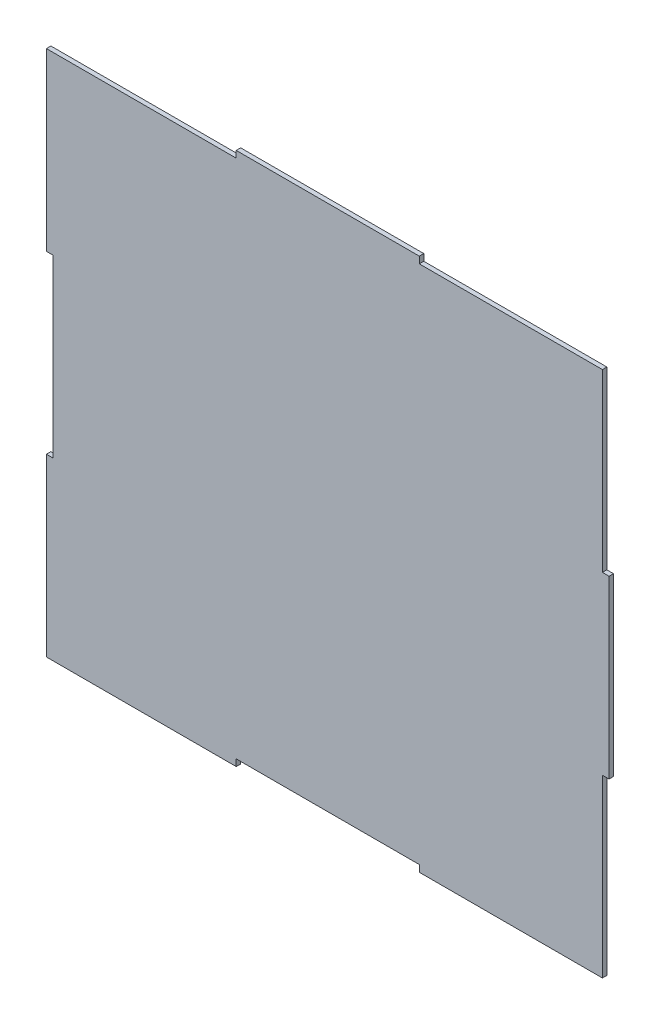
ISO-10303-21;
HEADER;
FILE_DESCRIPTION(('STEP AP214'),'2;1');
FILE_NAME('part.step','',(''),(''),'','','');
FILE_SCHEMA(('AUTOMOTIVE_DESIGN { 1 0 10303 214 1 1 1 1 }'));
ENDSEC;
DATA;
#1=APPLICATION_CONTEXT('core data for automotive mechanical design processes');
#2=APPLICATION_PROTOCOL_DEFINITION('international standard','automotive_design',2000,#1);
#3=PRODUCT_CONTEXT('',#1,'mechanical');
#4=PRODUCT('Part','Part','',(#3));
#5=PRODUCT_RELATED_PRODUCT_CATEGORY('part','',(#4));
#6=PRODUCT_DEFINITION_FORMATION('','',#4);
#7=PRODUCT_DEFINITION_CONTEXT('part definition',#1,'design');
#8=PRODUCT_DEFINITION('design','',#6,#7);
#9=PRODUCT_DEFINITION_SHAPE('','',#8);
#10=(LENGTH_UNIT() NAMED_UNIT(*) SI_UNIT(.MILLI.,.METRE.));
#11=(NAMED_UNIT(*) PLANE_ANGLE_UNIT() SI_UNIT($,.RADIAN.));
#12=(NAMED_UNIT(*) SI_UNIT($,.STERADIAN.) SOLID_ANGLE_UNIT());
#13=UNCERTAINTY_MEASURE_WITH_UNIT(LENGTH_MEASURE(1.E-05),#10,'distance_accuracy_value','');
#14=(GEOMETRIC_REPRESENTATION_CONTEXT(3) GLOBAL_UNCERTAINTY_ASSIGNED_CONTEXT((#13)) GLOBAL_UNIT_ASSIGNED_CONTEXT((#10,
#11,#12)) REPRESENTATION_CONTEXT('',''));
#15=CARTESIAN_POINT('',(0.,0.,0.));
#16=DIRECTION('',(0.,0.,1.));
#17=DIRECTION('',(1.,0.,0.));
#18=AXIS2_PLACEMENT_3D('',#15,#16,#17);
#19=CARTESIAN_POINT('',(-41.,-118.,2.));
#20=DIRECTION('',(-1.,0.,0.));
#21=DIRECTION('',(0.,0.,1.));
#22=AXIS2_PLACEMENT_3D('',#19,#20,#21);
#23=PLANE('',#22);
#24=DIRECTION('',(0.,1.,0.));
#25=VECTOR('',#24,1.);
#26=CARTESIAN_POINT('',(-41.,-118.,0.));
#27=LINE('',#26,#25);
#28=CARTESIAN_POINT('',(-41.,-118.,0.));
#29=VERTEX_POINT('',#28);
#30=CARTESIAN_POINT('',(-41.,-115.,0.));
#31=VERTEX_POINT('',#30);
#32=EDGE_CURVE('E202',#29,#31,#27,.T.);
#33=ORIENTED_EDGE('',*,*,#32,.T.);
#34=DIRECTION('',(0.,0.,-1.));
#35=VECTOR('',#34,1.);
#36=CARTESIAN_POINT('',(-41.,-115.,2.));
#37=LINE('',#36,#35);
#38=CARTESIAN_POINT('',(-41.,-115.,2.));
#39=VERTEX_POINT('',#38);
#40=EDGE_CURVE('E11',#39,#31,#37,.T.);
#41=ORIENTED_EDGE('',*,*,#40,.F.);
#42=DIRECTION('',(0.,1.,0.));
#43=VECTOR('',#42,1.);
#44=CARTESIAN_POINT('',(-41.,-118.,2.));
#45=LINE('',#44,#43);
#46=CARTESIAN_POINT('',(-41.,-118.,2.));
#47=VERTEX_POINT('',#46);
#48=EDGE_CURVE('E242',#47,#39,#45,.T.);
#49=ORIENTED_EDGE('',*,*,#48,.F.);
#50=DIRECTION('',(0.,0.,-1.));
#51=VECTOR('',#50,1.);
#52=CARTESIAN_POINT('',(-41.,-118.,2.));
#53=LINE('',#52,#51);
#54=EDGE_CURVE('E198',#47,#29,#53,.T.);
#55=ORIENTED_EDGE('',*,*,#54,.T.);
#56=EDGE_LOOP('',(#33,#41,#49,#55));
#57=FACE_BOUND('',#56,.T.);
#58=ADVANCED_FACE('F33',(#57),#23,.F.);
#59=CARTESIAN_POINT('',(-41.,-115.,2.));
#60=DIRECTION('',(0.,1.,0.));
#61=DIRECTION('',(0.,0.,1.));
#62=AXIS2_PLACEMENT_3D('',#59,#60,#61);
#63=PLANE('',#62);
#64=DIRECTION('',(1.,0.,0.));
#65=VECTOR('',#64,1.);
#66=CARTESIAN_POINT('',(-41.,-115.,0.));
#67=LINE('',#66,#65);
#68=CARTESIAN_POINT('',(41.,-115.,0.));
#69=VERTEX_POINT('',#68);
#70=EDGE_CURVE('E205',#31,#69,#67,.T.);
#71=ORIENTED_EDGE('',*,*,#70,.T.);
#72=DIRECTION('',(0.,0.,-1.));
#73=VECTOR('',#72,1.);
#74=CARTESIAN_POINT('',(41.,-115.,2.));
#75=LINE('',#74,#73);
#76=CARTESIAN_POINT('',(41.,-115.,2.));
#77=VERTEX_POINT('',#76);
#78=EDGE_CURVE('E41',#77,#69,#75,.T.);
#79=ORIENTED_EDGE('',*,*,#78,.F.);
#80=DIRECTION('',(1.,0.,0.));
#81=VECTOR('',#80,1.);
#82=CARTESIAN_POINT('',(-41.,-115.,2.));
#83=LINE('',#82,#81);
#84=EDGE_CURVE('E126',#39,#77,#83,.T.);
#85=ORIENTED_EDGE('',*,*,#84,.F.);
#86=ORIENTED_EDGE('',*,*,#40,.T.);
#87=EDGE_LOOP('',(#71,#79,#85,#86));
#88=FACE_BOUND('',#87,.T.);
#89=ADVANCED_FACE('F350',(#88),#63,.F.);
#90=CARTESIAN_POINT('',(41.,-118.,2.));
#91=DIRECTION('',(1.,0.,0.));
#92=DIRECTION('',(0.,0.,-1.));
#93=AXIS2_PLACEMENT_3D('',#90,#91,#92);
#94=PLANE('',#93);
#95=DIRECTION('',(0.,-1.,0.));
#96=VECTOR('',#95,1.);
#97=CARTESIAN_POINT('',(41.,-118.,0.));
#98=LINE('',#97,#96);
#99=CARTESIAN_POINT('',(41.,-118.,0.));
#100=VERTEX_POINT('',#99);
#101=EDGE_CURVE('E207',#69,#100,#98,.T.);
#102=ORIENTED_EDGE('',*,*,#101,.T.);
#103=DIRECTION('',(0.,0.,-1.));
#104=VECTOR('',#103,1.);
#105=CARTESIAN_POINT('',(41.,-118.,2.));
#106=LINE('',#105,#104);
#107=CARTESIAN_POINT('',(41.,-118.,2.));
#108=VERTEX_POINT('',#107);
#109=EDGE_CURVE('E285',#108,#100,#106,.T.);
#110=ORIENTED_EDGE('',*,*,#109,.F.);
#111=DIRECTION('',(0.,-1.,0.));
#112=VECTOR('',#111,1.);
#113=CARTESIAN_POINT('',(41.,-118.,2.));
#114=LINE('',#113,#112);
#115=EDGE_CURVE('E293',#77,#108,#114,.T.);
#116=ORIENTED_EDGE('',*,*,#115,.F.);
#117=ORIENTED_EDGE('',*,*,#78,.T.);
#118=EDGE_LOOP('',(#102,#110,#116,#117));
#119=FACE_BOUND('',#118,.T.);
#120=ADVANCED_FACE('F291',(#119),#94,.F.);
#121=CARTESIAN_POINT('',(41.,-118.,2.));
#122=DIRECTION('',(0.,1.,0.));
#123=DIRECTION('',(0.,0.,1.));
#124=AXIS2_PLACEMENT_3D('',#121,#122,#123);
#125=PLANE('',#124);
#126=DIRECTION('',(1.,0.,0.));
#127=VECTOR('',#126,1.);
#128=CARTESIAN_POINT('',(41.,-118.,0.));
#129=LINE('',#128,#127);
#130=CARTESIAN_POINT('',(123.,-118.,0.));
#131=VERTEX_POINT('',#130);
#132=EDGE_CURVE('E209',#100,#131,#129,.T.);
#133=ORIENTED_EDGE('',*,*,#132,.T.);
#134=DIRECTION('',(0.,0.,-1.));
#135=VECTOR('',#134,1.);
#136=CARTESIAN_POINT('',(123.,-118.,2.));
#137=LINE('',#136,#135);
#138=CARTESIAN_POINT('',(123.,-118.,2.));
#139=VERTEX_POINT('',#138);
#140=EDGE_CURVE('E282',#139,#131,#137,.T.);
#141=ORIENTED_EDGE('',*,*,#140,.F.);
#142=DIRECTION('',(1.,0.,0.));
#143=VECTOR('',#142,1.);
#144=CARTESIAN_POINT('',(41.,-118.,2.));
#145=LINE('',#144,#143);
#146=EDGE_CURVE('E309',#108,#139,#145,.T.);
#147=ORIENTED_EDGE('',*,*,#146,.F.);
#148=ORIENTED_EDGE('',*,*,#109,.T.);
#149=EDGE_LOOP('',(#133,#141,#147,#148));
#150=FACE_BOUND('',#149,.T.);
#151=ADVANCED_FACE('F300',(#150),#125,.F.);
#152=CARTESIAN_POINT('',(123.,-118.,2.));
#153=DIRECTION('',(-1.,0.,0.));
#154=DIRECTION('',(0.,0.,1.));
#155=AXIS2_PLACEMENT_3D('',#152,#153,#154);
#156=PLANE('',#155);
#157=DIRECTION('',(0.,1.,0.));
#158=VECTOR('',#157,1.);
#159=CARTESIAN_POINT('',(123.,-118.,0.));
#160=LINE('',#159,#158);
#161=CARTESIAN_POINT('',(123.,-39.3333333333333,0.));
#162=VERTEX_POINT('',#161);
#163=EDGE_CURVE('E211',#131,#162,#160,.T.);
#164=ORIENTED_EDGE('',*,*,#163,.T.);
#165=DIRECTION('',(0.,0.,-1.));
#166=VECTOR('',#165,1.);
#167=CARTESIAN_POINT('',(123.,-39.3333333333333,2.));
#168=LINE('',#167,#166);
#169=CARTESIAN_POINT('',(123.,-39.3333333333333,2.));
#170=VERTEX_POINT('',#169);
#171=EDGE_CURVE('E279',#170,#162,#168,.T.);
#172=ORIENTED_EDGE('',*,*,#171,.F.);
#173=DIRECTION('',(0.,1.,0.));
#174=VECTOR('',#173,1.);
#175=CARTESIAN_POINT('',(123.,-118.,2.));
#176=LINE('',#175,#174);
#177=EDGE_CURVE('E306',#139,#170,#176,.T.);
#178=ORIENTED_EDGE('',*,*,#177,.F.);
#179=ORIENTED_EDGE('',*,*,#140,.T.);
#180=EDGE_LOOP('',(#164,#172,#178,#179));
#181=FACE_BOUND('',#180,.T.);
#182=ADVANCED_FACE('F304',(#181),#156,.F.);
#183=CARTESIAN_POINT('',(123.,-39.3333333333333,2.));
#184=DIRECTION('',(0.,1.,0.));
#185=DIRECTION('',(0.,0.,1.));
#186=AXIS2_PLACEMENT_3D('',#183,#184,#185);
#187=PLANE('',#186);
#188=DIRECTION('',(1.,0.,0.));
#189=VECTOR('',#188,1.);
#190=CARTESIAN_POINT('',(123.,-39.3333333333333,0.));
#191=LINE('',#190,#189);
#192=CARTESIAN_POINT('',(126.,-39.3333333333333,0.));
#193=VERTEX_POINT('',#192);
#194=EDGE_CURVE('E213',#162,#193,#191,.T.);
#195=ORIENTED_EDGE('',*,*,#194,.T.);
#196=DIRECTION('',(0.,0.,-1.));
#197=VECTOR('',#196,1.);
#198=CARTESIAN_POINT('',(126.,-39.3333333333333,2.));
#199=LINE('',#198,#197);
#200=CARTESIAN_POINT('',(126.,-39.3333333333333,2.));
#201=VERTEX_POINT('',#200);
#202=EDGE_CURVE('E276',#201,#193,#199,.T.);
#203=ORIENTED_EDGE('',*,*,#202,.F.);
#204=DIRECTION('',(1.,0.,0.));
#205=VECTOR('',#204,1.);
#206=CARTESIAN_POINT('',(123.,-39.3333333333333,2.));
#207=LINE('',#206,#205);
#208=EDGE_CURVE('E308',#170,#201,#207,.T.);
#209=ORIENTED_EDGE('',*,*,#208,.F.);
#210=ORIENTED_EDGE('',*,*,#171,.T.);
#211=EDGE_LOOP('',(#195,#203,#209,#210));
#212=FACE_BOUND('',#211,.T.);
#213=ADVANCED_FACE('F362',(#212),#187,.F.);
#214=CARTESIAN_POINT('',(126.,-39.3333333333333,2.));
#215=DIRECTION('',(-1.,0.,0.));
#216=DIRECTION('',(0.,0.,1.));
#217=AXIS2_PLACEMENT_3D('',#214,#215,#216);
#218=PLANE('',#217);
#219=DIRECTION('',(0.,1.,0.));
#220=VECTOR('',#219,1.);
#221=CARTESIAN_POINT('',(126.,-39.3333333333333,0.));
#222=LINE('',#221,#220);
#223=CARTESIAN_POINT('',(126.,39.3333333333334,0.));
#224=VERTEX_POINT('',#223);
#225=EDGE_CURVE('E215',#193,#224,#222,.T.);
#226=ORIENTED_EDGE('',*,*,#225,.T.);
#227=DIRECTION('',(0.,0.,-1.));
#228=VECTOR('',#227,1.);
#229=CARTESIAN_POINT('',(126.,39.3333333333334,2.));
#230=LINE('',#229,#228);
#231=CARTESIAN_POINT('',(126.,39.3333333333334,2.));
#232=VERTEX_POINT('',#231);
#233=EDGE_CURVE('E273',#232,#224,#230,.T.);
#234=ORIENTED_EDGE('',*,*,#233,.F.);
#235=DIRECTION('',(0.,1.,0.));
#236=VECTOR('',#235,1.);
#237=CARTESIAN_POINT('',(126.,-39.3333333333333,2.));
#238=LINE('',#237,#236);
#239=EDGE_CURVE('E311',#201,#232,#238,.T.);
#240=ORIENTED_EDGE('',*,*,#239,.F.);
#241=ORIENTED_EDGE('',*,*,#202,.T.);
#242=EDGE_LOOP('',(#226,#234,#240,#241));
#243=FACE_BOUND('',#242,.T.);
#244=ADVANCED_FACE('F365',(#243),#218,.F.);
#245=CARTESIAN_POINT('',(123.,39.3333333333334,2.));
#246=DIRECTION('',(0.,-1.,0.));
#247=DIRECTION('',(0.,0.,-1.));
#248=AXIS2_PLACEMENT_3D('',#245,#246,#247);
#249=PLANE('',#248);
#250=DIRECTION('',(-1.,0.,0.));
#251=VECTOR('',#250,1.);
#252=CARTESIAN_POINT('',(123.,39.3333333333334,0.));
#253=LINE('',#252,#251);
#254=CARTESIAN_POINT('',(123.,39.3333333333334,0.));
#255=VERTEX_POINT('',#254);
#256=EDGE_CURVE('E217',#224,#255,#253,.T.);
#257=ORIENTED_EDGE('',*,*,#256,.T.);
#258=DIRECTION('',(0.,0.,-1.));
#259=VECTOR('',#258,1.);
#260=CARTESIAN_POINT('',(123.,39.3333333333334,2.));
#261=LINE('',#260,#259);
#262=CARTESIAN_POINT('',(123.,39.3333333333334,2.));
#263=VERTEX_POINT('',#262);
#264=EDGE_CURVE('E270',#263,#255,#261,.T.);
#265=ORIENTED_EDGE('',*,*,#264,.F.);
#266=DIRECTION('',(-1.,0.,0.));
#267=VECTOR('',#266,1.);
#268=CARTESIAN_POINT('',(123.,39.3333333333334,2.));
#269=LINE('',#268,#267);
#270=EDGE_CURVE('E317',#232,#263,#269,.T.);
#271=ORIENTED_EDGE('',*,*,#270,.F.);
#272=ORIENTED_EDGE('',*,*,#233,.T.);
#273=EDGE_LOOP('',(#257,#265,#271,#272));
#274=FACE_BOUND('',#273,.T.);
#275=ADVANCED_FACE('F369',(#274),#249,.F.);
#276=CARTESIAN_POINT('',(123.,39.3333333333334,2.));
#277=DIRECTION('',(-1.,0.,0.));
#278=DIRECTION('',(0.,0.,1.));
#279=AXIS2_PLACEMENT_3D('',#276,#277,#278);
#280=PLANE('',#279);
#281=DIRECTION('',(0.,1.,0.));
#282=VECTOR('',#281,1.);
#283=CARTESIAN_POINT('',(123.,39.3333333333334,0.));
#284=LINE('',#283,#282);
#285=CARTESIAN_POINT('',(123.,118.,0.));
#286=VERTEX_POINT('',#285);
#287=EDGE_CURVE('E219',#255,#286,#284,.T.);
#288=ORIENTED_EDGE('',*,*,#287,.T.);
#289=DIRECTION('',(0.,0.,-1.));
#290=VECTOR('',#289,1.);
#291=CARTESIAN_POINT('',(123.,118.,2.));
#292=LINE('',#291,#290);
#293=CARTESIAN_POINT('',(123.,118.,2.));
#294=VERTEX_POINT('',#293);
#295=EDGE_CURVE('E267',#294,#286,#292,.T.);
#296=ORIENTED_EDGE('',*,*,#295,.F.);
#297=DIRECTION('',(0.,1.,0.));
#298=VECTOR('',#297,1.);
#299=CARTESIAN_POINT('',(123.,39.3333333333334,2.));
#300=LINE('',#299,#298);
#301=EDGE_CURVE('E319',#263,#294,#300,.T.);
#302=ORIENTED_EDGE('',*,*,#301,.F.);
#303=ORIENTED_EDGE('',*,*,#264,.T.);
#304=EDGE_LOOP('',(#288,#296,#302,#303));
#305=FACE_BOUND('',#304,.T.);
#306=ADVANCED_FACE('F373',(#305),#280,.F.);
#307=CARTESIAN_POINT('',(41.,118.,2.));
#308=DIRECTION('',(0.,-1.,0.));
#309=DIRECTION('',(0.,0.,-1.));
#310=AXIS2_PLACEMENT_3D('',#307,#308,#309);
#311=PLANE('',#310);
#312=DIRECTION('',(-1.,0.,0.));
#313=VECTOR('',#312,1.);
#314=CARTESIAN_POINT('',(41.,118.,0.));
#315=LINE('',#314,#313);
#316=CARTESIAN_POINT('',(41.,118.,0.));
#317=VERTEX_POINT('',#316);
#318=EDGE_CURVE('E221',#286,#317,#315,.T.);
#319=ORIENTED_EDGE('',*,*,#318,.T.);
#320=DIRECTION('',(0.,0.,-1.));
#321=VECTOR('',#320,1.);
#322=CARTESIAN_POINT('',(41.,118.,2.));
#323=LINE('',#322,#321);
#324=CARTESIAN_POINT('',(41.,118.,2.));
#325=VERTEX_POINT('',#324);
#326=EDGE_CURVE('E264',#325,#317,#323,.T.);
#327=ORIENTED_EDGE('',*,*,#326,.F.);
#328=DIRECTION('',(-1.,0.,0.));
#329=VECTOR('',#328,1.);
#330=CARTESIAN_POINT('',(41.,118.,2.));
#331=LINE('',#330,#329);
#332=EDGE_CURVE('E321',#294,#325,#331,.T.);
#333=ORIENTED_EDGE('',*,*,#332,.F.);
#334=ORIENTED_EDGE('',*,*,#295,.T.);
#335=EDGE_LOOP('',(#319,#327,#333,#334));
#336=FACE_BOUND('',#335,.T.);
#337=ADVANCED_FACE('F377',(#336),#311,.F.);
#338=CARTESIAN_POINT('',(41.,118.,2.));
#339=DIRECTION('',(-1.,0.,0.));
#340=DIRECTION('',(0.,0.,1.));
#341=AXIS2_PLACEMENT_3D('',#338,#339,#340);
#342=PLANE('',#341);
#343=DIRECTION('',(0.,1.,0.));
#344=VECTOR('',#343,1.);
#345=CARTESIAN_POINT('',(41.,118.,0.));
#346=LINE('',#345,#344);
#347=CARTESIAN_POINT('',(41.,121.,0.));
#348=VERTEX_POINT('',#347);
#349=EDGE_CURVE('E223',#317,#348,#346,.T.);
#350=ORIENTED_EDGE('',*,*,#349,.T.);
#351=DIRECTION('',(0.,0.,-1.));
#352=VECTOR('',#351,1.);
#353=CARTESIAN_POINT('',(41.,121.,2.));
#354=LINE('',#353,#352);
#355=CARTESIAN_POINT('',(41.,121.,2.));
#356=VERTEX_POINT('',#355);
#357=EDGE_CURVE('E261',#356,#348,#354,.T.);
#358=ORIENTED_EDGE('',*,*,#357,.F.);
#359=DIRECTION('',(0.,1.,0.));
#360=VECTOR('',#359,1.);
#361=CARTESIAN_POINT('',(41.,118.,2.));
#362=LINE('',#361,#360);
#363=EDGE_CURVE('E323',#325,#356,#362,.T.);
#364=ORIENTED_EDGE('',*,*,#363,.F.);
#365=ORIENTED_EDGE('',*,*,#326,.T.);
#366=EDGE_LOOP('',(#350,#358,#364,#365));
#367=FACE_BOUND('',#366,.T.);
#368=ADVANCED_FACE('F381',(#367),#342,.F.);
#369=CARTESIAN_POINT('',(-41.,121.,2.));
#370=DIRECTION('',(0.,-1.,0.));
#371=DIRECTION('',(1.,0.,0.));
#372=AXIS2_PLACEMENT_3D('',#369,#370,#371);
#373=PLANE('',#372);
#374=DIRECTION('',(-1.,0.,0.));
#375=VECTOR('',#374,1.);
#376=CARTESIAN_POINT('',(-41.,121.,0.));
#377=LINE('',#376,#375);
#378=CARTESIAN_POINT('',(-41.,121.,0.));
#379=VERTEX_POINT('',#378);
#380=EDGE_CURVE('E225',#348,#379,#377,.T.);
#381=ORIENTED_EDGE('',*,*,#380,.T.);
#382=DIRECTION('',(0.,0.,-1.));
#383=VECTOR('',#382,1.);
#384=CARTESIAN_POINT('',(-41.,121.,2.));
#385=LINE('',#384,#383);
#386=CARTESIAN_POINT('',(-41.,121.,2.));
#387=VERTEX_POINT('',#386);
#388=EDGE_CURVE('E258',#387,#379,#385,.T.);
#389=ORIENTED_EDGE('',*,*,#388,.F.);
#390=DIRECTION('',(-1.,0.,0.));
#391=VECTOR('',#390,1.);
#392=CARTESIAN_POINT('',(-41.,121.,2.));
#393=LINE('',#392,#391);
#394=EDGE_CURVE('E325',#356,#387,#393,.T.);
#395=ORIENTED_EDGE('',*,*,#394,.F.);
#396=ORIENTED_EDGE('',*,*,#357,.T.);
#397=EDGE_LOOP('',(#381,#389,#395,#396));
#398=FACE_BOUND('',#397,.T.);
#399=ADVANCED_FACE('F385',(#398),#373,.F.);
#400=CARTESIAN_POINT('',(-41.,118.,2.));
#401=DIRECTION('',(1.,0.,0.));
#402=DIRECTION('',(0.,0.,-1.));
#403=AXIS2_PLACEMENT_3D('',#400,#401,#402);
#404=PLANE('',#403);
#405=DIRECTION('',(0.,-1.,0.));
#406=VECTOR('',#405,1.);
#407=CARTESIAN_POINT('',(-41.,118.,0.));
#408=LINE('',#407,#406);
#409=CARTESIAN_POINT('',(-41.,118.,0.));
#410=VERTEX_POINT('',#409);
#411=EDGE_CURVE('E227',#379,#410,#408,.T.);
#412=ORIENTED_EDGE('',*,*,#411,.T.);
#413=DIRECTION('',(0.,0.,-1.));
#414=VECTOR('',#413,1.);
#415=CARTESIAN_POINT('',(-41.,118.,2.));
#416=LINE('',#415,#414);
#417=CARTESIAN_POINT('',(-41.,118.,2.));
#418=VERTEX_POINT('',#417);
#419=EDGE_CURVE('E255',#418,#410,#416,.T.);
#420=ORIENTED_EDGE('',*,*,#419,.F.);
#421=DIRECTION('',(0.,-1.,0.));
#422=VECTOR('',#421,1.);
#423=CARTESIAN_POINT('',(-41.,118.,2.));
#424=LINE('',#423,#422);
#425=EDGE_CURVE('E327',#387,#418,#424,.T.);
#426=ORIENTED_EDGE('',*,*,#425,.F.);
#427=ORIENTED_EDGE('',*,*,#388,.T.);
#428=EDGE_LOOP('',(#412,#420,#426,#427));
#429=FACE_BOUND('',#428,.T.);
#430=ADVANCED_FACE('F389',(#429),#404,.F.);
#431=CARTESIAN_POINT('',(-123.,118.,2.));
#432=DIRECTION('',(0.,-1.,0.));
#433=DIRECTION('',(1.,0.,0.));
#434=AXIS2_PLACEMENT_3D('',#431,#432,#433);
#435=PLANE('',#434);
#436=DIRECTION('',(-1.,0.,0.));
#437=VECTOR('',#436,1.);
#438=CARTESIAN_POINT('',(-123.,118.,0.));
#439=LINE('',#438,#437);
#440=CARTESIAN_POINT('',(-126.,118.,0.));
#441=VERTEX_POINT('',#440);
#442=EDGE_CURVE('E230',#410,#441,#439,.T.);
#443=ORIENTED_EDGE('',*,*,#442,.T.);
#444=DIRECTION('',(0.,0.,-1.));
#445=VECTOR('',#444,1.);
#446=CARTESIAN_POINT('',(-126.,118.,2.));
#447=LINE('',#446,#445);
#448=CARTESIAN_POINT('',(-126.,118.,2.));
#449=VERTEX_POINT('',#448);
#450=EDGE_CURVE('E252',#449,#441,#447,.T.);
#451=ORIENTED_EDGE('',*,*,#450,.F.);
#452=DIRECTION('',(-1.,0.,0.));
#453=VECTOR('',#452,1.);
#454=CARTESIAN_POINT('',(-123.,118.,2.));
#455=LINE('',#454,#453);
#456=EDGE_CURVE('E329',#418,#449,#455,.T.);
#457=ORIENTED_EDGE('',*,*,#456,.F.);
#458=ORIENTED_EDGE('',*,*,#419,.T.);
#459=EDGE_LOOP('',(#443,#451,#457,#458));
#460=FACE_BOUND('',#459,.T.);
#461=ADVANCED_FACE('F393',(#460),#435,.F.);
#462=CARTESIAN_POINT('',(-126.,118.,2.));
#463=DIRECTION('',(1.,0.,0.));
#464=DIRECTION('',(0.,0.,-1.));
#465=AXIS2_PLACEMENT_3D('',#462,#463,#464);
#466=PLANE('',#465);
#467=DIRECTION('',(0.,-1.,0.));
#468=VECTOR('',#467,1.);
#469=CARTESIAN_POINT('',(-126.,118.,0.));
#470=LINE('',#469,#468);
#471=CARTESIAN_POINT('',(-126.,39.3333333333334,0.));
#472=VERTEX_POINT('',#471);
#473=EDGE_CURVE('E232',#441,#472,#470,.T.);
#474=ORIENTED_EDGE('',*,*,#473,.T.);
#475=DIRECTION('',(0.,0.,-1.));
#476=VECTOR('',#475,1.);
#477=CARTESIAN_POINT('',(-126.,39.3333333333334,2.));
#478=LINE('',#477,#476);
#479=CARTESIAN_POINT('',(-126.,39.3333333333334,2.));
#480=VERTEX_POINT('',#479);
#481=EDGE_CURVE('E249',#480,#472,#478,.T.);
#482=ORIENTED_EDGE('',*,*,#481,.F.);
#483=DIRECTION('',(0.,-1.,0.));
#484=VECTOR('',#483,1.);
#485=CARTESIAN_POINT('',(-126.,118.,2.));
#486=LINE('',#485,#484);
#487=EDGE_CURVE('E331',#449,#480,#486,.T.);
#488=ORIENTED_EDGE('',*,*,#487,.F.);
#489=ORIENTED_EDGE('',*,*,#450,.T.);
#490=EDGE_LOOP('',(#474,#482,#488,#489));
#491=FACE_BOUND('',#490,.T.);
#492=ADVANCED_FACE('F397',(#491),#466,.F.);
#493=CARTESIAN_POINT('',(-123.,39.3333333333334,2.));
#494=DIRECTION('',(0.,1.,0.));
#495=DIRECTION('',(0.,0.,1.));
#496=AXIS2_PLACEMENT_3D('',#493,#494,#495);
#497=PLANE('',#496);
#498=DIRECTION('',(1.,0.,0.));
#499=VECTOR('',#498,1.);
#500=CARTESIAN_POINT('',(-123.,39.3333333333334,0.));
#501=LINE('',#500,#499);
#502=CARTESIAN_POINT('',(-123.,39.3333333333334,0.));
#503=VERTEX_POINT('',#502);
#504=EDGE_CURVE('E234',#472,#503,#501,.T.);
#505=ORIENTED_EDGE('',*,*,#504,.T.);
#506=DIRECTION('',(0.,0.,-1.));
#507=VECTOR('',#506,1.);
#508=CARTESIAN_POINT('',(-123.,39.3333333333334,2.));
#509=LINE('',#508,#507);
#510=CARTESIAN_POINT('',(-123.,39.3333333333334,2.));
#511=VERTEX_POINT('',#510);
#512=EDGE_CURVE('E246',#511,#503,#509,.T.);
#513=ORIENTED_EDGE('',*,*,#512,.F.);
#514=DIRECTION('',(1.,0.,0.));
#515=VECTOR('',#514,1.);
#516=CARTESIAN_POINT('',(-123.,39.3333333333334,2.));
#517=LINE('',#516,#515);
#518=EDGE_CURVE('E333',#480,#511,#517,.T.);
#519=ORIENTED_EDGE('',*,*,#518,.F.);
#520=ORIENTED_EDGE('',*,*,#481,.T.);
#521=EDGE_LOOP('',(#505,#513,#519,#520));
#522=FACE_BOUND('',#521,.T.);
#523=ADVANCED_FACE('F339',(#522),#497,.F.);
#524=CARTESIAN_POINT('',(-123.,-39.3333333333333,2.));
#525=DIRECTION('',(1.,0.,0.));
#526=DIRECTION('',(0.,0.,-1.));
#527=AXIS2_PLACEMENT_3D('',#524,#525,#526);
#528=PLANE('',#527);
#529=DIRECTION('',(0.,-1.,0.));
#530=VECTOR('',#529,1.);
#531=CARTESIAN_POINT('',(-123.,-39.3333333333333,0.));
#532=LINE('',#531,#530);
#533=CARTESIAN_POINT('',(-123.,-39.3333333333333,0.));
#534=VERTEX_POINT('',#533);
#535=EDGE_CURVE('E236',#503,#534,#532,.T.);
#536=ORIENTED_EDGE('',*,*,#535,.T.);
#537=DIRECTION('',(0.,0.,-1.));
#538=VECTOR('',#537,1.);
#539=CARTESIAN_POINT('',(-123.,-39.3333333333333,2.));
#540=LINE('',#539,#538);
#541=CARTESIAN_POINT('',(-123.,-39.3333333333333,2.));
#542=VERTEX_POINT('',#541);
#543=EDGE_CURVE('E193',#542,#534,#540,.T.);
#544=ORIENTED_EDGE('',*,*,#543,.F.);
#545=DIRECTION('',(0.,-1.,0.));
#546=VECTOR('',#545,1.);
#547=CARTESIAN_POINT('',(-123.,-39.3333333333333,2.));
#548=LINE('',#547,#546);
#549=EDGE_CURVE('E182',#511,#542,#548,.T.);
#550=ORIENTED_EDGE('',*,*,#549,.F.);
#551=ORIENTED_EDGE('',*,*,#512,.T.);
#552=EDGE_LOOP('',(#536,#544,#550,#551));
#553=FACE_BOUND('',#552,.T.);
#554=ADVANCED_FACE('F343',(#553),#528,.F.);
#555=CARTESIAN_POINT('',(-123.,-39.3333333333333,2.));
#556=DIRECTION('',(0.,-1.,0.));
#557=DIRECTION('',(0.,0.,-1.));
#558=AXIS2_PLACEMENT_3D('',#555,#556,#557);
#559=PLANE('',#558);
#560=DIRECTION('',(-1.,0.,0.));
#561=VECTOR('',#560,1.);
#562=CARTESIAN_POINT('',(-123.,-39.3333333333333,0.));
#563=LINE('',#562,#561);
#564=CARTESIAN_POINT('',(-126.,-39.3333333333333,0.));
#565=VERTEX_POINT('',#564);
#566=EDGE_CURVE('E191',#534,#565,#563,.T.);
#567=ORIENTED_EDGE('',*,*,#566,.T.);
#568=DIRECTION('',(0.,0.,-1.));
#569=VECTOR('',#568,1.);
#570=CARTESIAN_POINT('',(-126.,-39.3333333333333,2.));
#571=LINE('',#570,#569);
#572=CARTESIAN_POINT('',(-126.,-39.3333333333333,2.));
#573=VERTEX_POINT('',#572);
#574=EDGE_CURVE('E188',#573,#565,#571,.T.);
#575=ORIENTED_EDGE('',*,*,#574,.F.);
#576=DIRECTION('',(-1.,0.,0.));
#577=VECTOR('',#576,1.);
#578=CARTESIAN_POINT('',(-123.,-39.3333333333333,2.));
#579=LINE('',#578,#577);
#580=EDGE_CURVE('E175',#542,#573,#579,.T.);
#581=ORIENTED_EDGE('',*,*,#580,.F.);
#582=ORIENTED_EDGE('',*,*,#543,.T.);
#583=EDGE_LOOP('',(#567,#575,#581,#582));
#584=FACE_BOUND('',#583,.T.);
#585=ADVANCED_FACE('F189',(#584),#559,.F.);
#586=CARTESIAN_POINT('',(-126.,-118.,2.));
#587=DIRECTION('',(1.,0.,0.));
#588=DIRECTION('',(0.,0.,-1.));
#589=AXIS2_PLACEMENT_3D('',#586,#587,#588);
#590=PLANE('',#589);
#591=DIRECTION('',(0.,-1.,0.));
#592=VECTOR('',#591,1.);
#593=CARTESIAN_POINT('',(-126.,-118.,0.));
#594=LINE('',#593,#592);
#595=CARTESIAN_POINT('',(-126.,-118.,0.));
#596=VERTEX_POINT('',#595);
#597=EDGE_CURVE('E239',#565,#596,#594,.T.);
#598=ORIENTED_EDGE('',*,*,#597,.T.);
#599=DIRECTION('',(0.,0.,-1.));
#600=VECTOR('',#599,1.);
#601=CARTESIAN_POINT('',(-126.,-118.,2.));
#602=LINE('',#601,#600);
#603=CARTESIAN_POINT('',(-126.,-118.,2.));
#604=VERTEX_POINT('',#603);
#605=EDGE_CURVE('E194',#604,#596,#602,.T.);
#606=ORIENTED_EDGE('',*,*,#605,.F.);
#607=DIRECTION('',(0.,-1.,0.));
#608=VECTOR('',#607,1.);
#609=CARTESIAN_POINT('',(-126.,-118.,2.));
#610=LINE('',#609,#608);
#611=EDGE_CURVE('E179',#573,#604,#610,.T.);
#612=ORIENTED_EDGE('',*,*,#611,.F.);
#613=ORIENTED_EDGE('',*,*,#574,.T.);
#614=EDGE_LOOP('',(#598,#606,#612,#613));
#615=FACE_BOUND('',#614,.T.);
#616=ADVANCED_FACE('F196',(#615),#590,.F.);
#617=CARTESIAN_POINT('',(-123.,-118.,2.));
#618=DIRECTION('',(0.,1.,0.));
#619=DIRECTION('',(0.,0.,1.));
#620=AXIS2_PLACEMENT_3D('',#617,#618,#619);
#621=PLANE('',#620);
#622=DIRECTION('',(1.,0.,0.));
#623=VECTOR('',#622,1.);
#624=CARTESIAN_POINT('',(-123.,-118.,0.));
#625=LINE('',#624,#623);
#626=EDGE_CURVE('E114',#596,#29,#625,.T.);
#627=ORIENTED_EDGE('',*,*,#626,.T.);
#628=ORIENTED_EDGE('',*,*,#54,.F.);
#629=DIRECTION('',(1.,0.,0.));
#630=VECTOR('',#629,1.);
#631=CARTESIAN_POINT('',(-123.,-118.,2.));
#632=LINE('',#631,#630);
#633=EDGE_CURVE('E49',#604,#47,#632,.T.);
#634=ORIENTED_EDGE('',*,*,#633,.F.);
#635=ORIENTED_EDGE('',*,*,#605,.T.);
#636=EDGE_LOOP('',(#627,#628,#634,#635));
#637=FACE_BOUND('',#636,.T.);
#638=ADVANCED_FACE('F344',(#637),#621,.F.);
#639=CARTESIAN_POINT('',(0.,0.,2.));
#640=DIRECTION('',(0.,0.,-1.));
#641=DIRECTION('',(-1.,0.,0.));
#642=AXIS2_PLACEMENT_3D('',#639,#640,#641);
#643=PLANE('',#642);
#644=ORIENTED_EDGE('',*,*,#48,.T.);
#645=ORIENTED_EDGE('',*,*,#84,.T.);
#646=ORIENTED_EDGE('',*,*,#115,.T.);
#647=ORIENTED_EDGE('',*,*,#146,.T.);
#648=ORIENTED_EDGE('',*,*,#177,.T.);
#649=ORIENTED_EDGE('',*,*,#208,.T.);
#650=ORIENTED_EDGE('',*,*,#239,.T.);
#651=ORIENTED_EDGE('',*,*,#270,.T.);
#652=ORIENTED_EDGE('',*,*,#301,.T.);
#653=ORIENTED_EDGE('',*,*,#332,.T.);
#654=ORIENTED_EDGE('',*,*,#363,.T.);
#655=ORIENTED_EDGE('',*,*,#394,.T.);
#656=ORIENTED_EDGE('',*,*,#425,.T.);
#657=ORIENTED_EDGE('',*,*,#456,.T.);
#658=ORIENTED_EDGE('',*,*,#487,.T.);
#659=ORIENTED_EDGE('',*,*,#518,.T.);
#660=ORIENTED_EDGE('',*,*,#549,.T.);
#661=ORIENTED_EDGE('',*,*,#580,.T.);
#662=ORIENTED_EDGE('',*,*,#611,.T.);
#663=ORIENTED_EDGE('',*,*,#633,.T.);
#664=EDGE_LOOP('',(#644,#645,#646,#647,#648,#649,#650,#651,#652,#653,#654,#655,#656,#657,#658,
#659,#660,#661,#662,#663));
#665=FACE_BOUND('',#664,.T.);
#666=ADVANCED_FACE('F177',(#665),#643,.F.);
#667=CARTESIAN_POINT('',(0.,0.,0.));
#668=DIRECTION('',(0.,0.,-1.));
#669=DIRECTION('',(-1.,0.,0.));
#670=AXIS2_PLACEMENT_3D('',#667,#668,#669);
#671=PLANE('',#670);
#672=ORIENTED_EDGE('',*,*,#32,.F.);
#673=ORIENTED_EDGE('',*,*,#626,.F.);
#674=ORIENTED_EDGE('',*,*,#597,.F.);
#675=ORIENTED_EDGE('',*,*,#566,.F.);
#676=ORIENTED_EDGE('',*,*,#535,.F.);
#677=ORIENTED_EDGE('',*,*,#504,.F.);
#678=ORIENTED_EDGE('',*,*,#473,.F.);
#679=ORIENTED_EDGE('',*,*,#442,.F.);
#680=ORIENTED_EDGE('',*,*,#411,.F.);
#681=ORIENTED_EDGE('',*,*,#380,.F.);
#682=ORIENTED_EDGE('',*,*,#349,.F.);
#683=ORIENTED_EDGE('',*,*,#318,.F.);
#684=ORIENTED_EDGE('',*,*,#287,.F.);
#685=ORIENTED_EDGE('',*,*,#256,.F.);
#686=ORIENTED_EDGE('',*,*,#225,.F.);
#687=ORIENTED_EDGE('',*,*,#194,.F.);
#688=ORIENTED_EDGE('',*,*,#163,.F.);
#689=ORIENTED_EDGE('',*,*,#132,.F.);
#690=ORIENTED_EDGE('',*,*,#101,.F.);
#691=ORIENTED_EDGE('',*,*,#70,.F.);
#692=EDGE_LOOP('',(#672,#673,#674,#675,#676,#677,#678,#679,#680,#681,#682,#683,#684,#685,#686,
#687,#688,#689,#690,#691));
#693=FACE_BOUND('',#692,.T.);
#694=ADVANCED_FACE('F295',(#693),#671,.T.);
#695=CLOSED_SHELL('',(#58,#89,#120,#151,#182,#213,#244,#275,#306,#337,#368,#399,#430,#461,#492,
#523,#554,#585,#616,#638,#666,#694));
#696=MANIFOLD_SOLID_BREP('B2',#695);
#697=ADVANCED_BREP_SHAPE_REPRESENTATION('',(#18,#696),#14);
#698=SHAPE_DEFINITION_REPRESENTATION(#9,#697);
ENDSEC;
END-ISO-10303-21;
